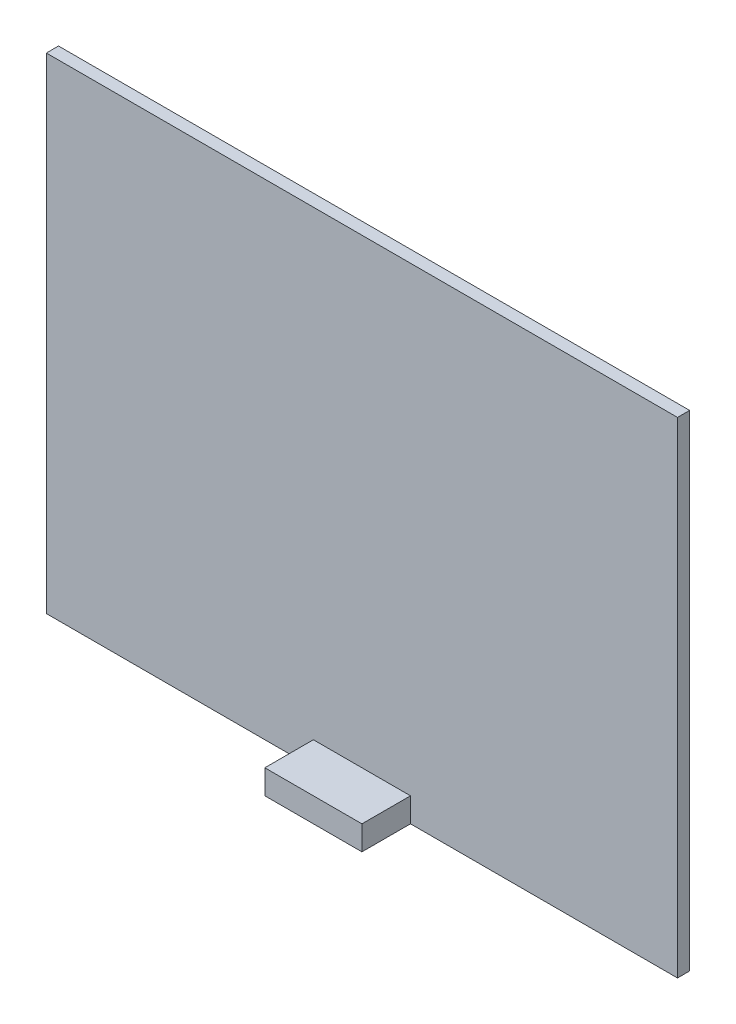
ISO-10303-21;
HEADER;
FILE_DESCRIPTION(('STEP AP214'),'2;1');
FILE_NAME('part.step','',(''),(''),'','','');
FILE_SCHEMA(('AUTOMOTIVE_DESIGN { 1 0 10303 214 1 1 1 1 }'));
ENDSEC;
DATA;
#1=APPLICATION_CONTEXT('core data for automotive mechanical design processes');
#2=APPLICATION_PROTOCOL_DEFINITION('international standard','automotive_design',2000,#1);
#3=PRODUCT_CONTEXT('',#1,'mechanical');
#4=PRODUCT('Part','Part','',(#3));
#5=PRODUCT_RELATED_PRODUCT_CATEGORY('part','',(#4));
#6=PRODUCT_DEFINITION_FORMATION('','',#4);
#7=PRODUCT_DEFINITION_CONTEXT('part definition',#1,'design');
#8=PRODUCT_DEFINITION('design','',#6,#7);
#9=PRODUCT_DEFINITION_SHAPE('','',#8);
#10=(LENGTH_UNIT() NAMED_UNIT(*) SI_UNIT(.MILLI.,.METRE.));
#11=(NAMED_UNIT(*) PLANE_ANGLE_UNIT() SI_UNIT($,.RADIAN.));
#12=(NAMED_UNIT(*) SI_UNIT($,.STERADIAN.) SOLID_ANGLE_UNIT());
#13=UNCERTAINTY_MEASURE_WITH_UNIT(LENGTH_MEASURE(1.E-05),#10,'distance_accuracy_value','');
#14=(GEOMETRIC_REPRESENTATION_CONTEXT(3) GLOBAL_UNCERTAINTY_ASSIGNED_CONTEXT((#13)) GLOBAL_UNIT_ASSIGNED_CONTEXT((#10,
#11,#12)) REPRESENTATION_CONTEXT('',''));
#15=CARTESIAN_POINT('',(0.,0.,0.));
#16=DIRECTION('',(0.,0.,1.));
#17=DIRECTION('',(1.,0.,0.));
#18=AXIS2_PLACEMENT_3D('',#15,#16,#17);
#19=CARTESIAN_POINT('',(-150.,100.,5.));
#20=DIRECTION('',(0.,-1.,0.));
#21=DIRECTION('',(0.,0.,-1.));
#22=AXIS2_PLACEMENT_3D('',#19,#20,#21);
#23=PLANE('',#22);
#24=DIRECTION('',(-1.,0.,0.));
#25=VECTOR('',#24,1.);
#26=CARTESIAN_POINT('',(-150.,100.,5.));
#27=LINE('',#26,#25);
#28=CARTESIAN_POINT('',(130.,100.,5.));
#29=VERTEX_POINT('',#28);
#30=CARTESIAN_POINT('',(-130.,100.,5.));
#31=VERTEX_POINT('',#30);
#32=EDGE_CURVE('E160',#29,#31,#27,.T.);
#33=ORIENTED_EDGE('',*,*,#32,.F.);
#34=DIRECTION('',(0.,0.,1.));
#35=VECTOR('',#34,1.);
#36=CARTESIAN_POINT('',(130.,100.,0.));
#37=LINE('',#36,#35);
#38=CARTESIAN_POINT('',(130.,100.,0.));
#39=VERTEX_POINT('',#38);
#40=EDGE_CURVE('E143',#39,#29,#37,.T.);
#41=ORIENTED_EDGE('',*,*,#40,.F.);
#42=DIRECTION('',(-1.,0.,0.));
#43=VECTOR('',#42,1.);
#44=CARTESIAN_POINT('',(-150.,100.,0.));
#45=LINE('',#44,#43);
#46=CARTESIAN_POINT('',(-130.,100.,0.));
#47=VERTEX_POINT('',#46);
#48=EDGE_CURVE('E159',#39,#47,#45,.T.);
#49=ORIENTED_EDGE('',*,*,#48,.T.);
#50=DIRECTION('',(0.,0.,1.));
#51=VECTOR('',#50,1.);
#52=CARTESIAN_POINT('',(-130.,100.,0.));
#53=LINE('',#52,#51);
#54=EDGE_CURVE('E140',#47,#31,#53,.T.);
#55=ORIENTED_EDGE('',*,*,#54,.T.);
#56=EDGE_LOOP('',(#33,#41,#49,#55));
#57=FACE_BOUND('',#56,.T.);
#58=ADVANCED_FACE('F37',(#57),#23,.F.);
#59=CARTESIAN_POINT('',(-150.,-100.,5.));
#60=DIRECTION('',(0.,1.,0.));
#61=DIRECTION('',(0.,0.,1.));
#62=AXIS2_PLACEMENT_3D('',#59,#60,#61);
#63=PLANE('',#62);
#64=DIRECTION('',(1.,0.,0.));
#65=VECTOR('',#64,1.);
#66=CARTESIAN_POINT('',(-150.,-100.,5.));
#67=LINE('',#66,#65);
#68=CARTESIAN_POINT('',(20.,-100.,5.));
#69=VERTEX_POINT('',#68);
#70=CARTESIAN_POINT('',(130.,-100.,5.));
#71=VERTEX_POINT('',#70);
#72=EDGE_CURVE('E45',#69,#71,#67,.T.);
#73=ORIENTED_EDGE('',*,*,#72,.F.);
#74=DIRECTION('',(0.,0.,1.));
#75=VECTOR('',#74,1.);
#76=CARTESIAN_POINT('',(20.,-100.,25.));
#77=LINE('',#76,#75);
#78=CARTESIAN_POINT('',(20.,-100.,25.));
#79=VERTEX_POINT('',#78);
#80=EDGE_CURVE('E129',#69,#79,#77,.T.);
#81=ORIENTED_EDGE('',*,*,#80,.T.);
#82=DIRECTION('',(-1.,0.,0.));
#83=VECTOR('',#82,1.);
#84=CARTESIAN_POINT('',(-20.,-100.,25.));
#85=LINE('',#84,#83);
#86=CARTESIAN_POINT('',(-20.,-100.,25.));
#87=VERTEX_POINT('',#86);
#88=EDGE_CURVE('E117',#79,#87,#85,.T.);
#89=ORIENTED_EDGE('',*,*,#88,.T.);
#90=DIRECTION('',(0.,0.,-1.));
#91=VECTOR('',#90,1.);
#92=CARTESIAN_POINT('',(-20.,-100.,25.));
#93=LINE('',#92,#91);
#94=CARTESIAN_POINT('',(-20.,-100.,5.));
#95=VERTEX_POINT('',#94);
#96=EDGE_CURVE('E126',#87,#95,#93,.T.);
#97=ORIENTED_EDGE('',*,*,#96,.T.);
#98=CARTESIAN_POINT('',(-130.,-100.,5.));
#99=VERTEX_POINT('',#98);
#100=EDGE_CURVE('E11',#99,#95,#67,.T.);
#101=ORIENTED_EDGE('',*,*,#100,.F.);
#102=DIRECTION('',(0.,0.,1.));
#103=VECTOR('',#102,1.);
#104=CARTESIAN_POINT('',(-130.,-100.,0.));
#105=LINE('',#104,#103);
#106=CARTESIAN_POINT('',(-130.,-100.,0.));
#107=VERTEX_POINT('',#106);
#108=EDGE_CURVE('E146',#107,#99,#105,.T.);
#109=ORIENTED_EDGE('',*,*,#108,.F.);
#110=DIRECTION('',(1.,0.,0.));
#111=VECTOR('',#110,1.);
#112=CARTESIAN_POINT('',(-150.,-100.,0.));
#113=LINE('',#112,#111);
#114=CARTESIAN_POINT('',(130.,-100.,0.));
#115=VERTEX_POINT('',#114);
#116=EDGE_CURVE('E40',#107,#115,#113,.T.);
#117=ORIENTED_EDGE('',*,*,#116,.T.);
#118=DIRECTION('',(0.,0.,1.));
#119=VECTOR('',#118,1.);
#120=CARTESIAN_POINT('',(130.,-100.,0.));
#121=LINE('',#120,#119);
#122=EDGE_CURVE('E149',#115,#71,#121,.T.);
#123=ORIENTED_EDGE('',*,*,#122,.T.);
#124=EDGE_LOOP('',(#73,#81,#89,#97,#101,#109,#117,#123));
#125=FACE_BOUND('',#124,.T.);
#126=ADVANCED_FACE('F170',(#125),#63,.F.);
#127=CARTESIAN_POINT('',(0.,0.,5.));
#128=DIRECTION('',(0.,0.,1.));
#129=DIRECTION('',(1.,0.,0.));
#130=AXIS2_PLACEMENT_3D('',#127,#128,#129);
#131=PLANE('',#130);
#132=DIRECTION('',(0.,-1.,0.));
#133=VECTOR('',#132,1.);
#134=CARTESIAN_POINT('',(-20.,0.,5.));
#135=LINE('',#134,#133);
#136=CARTESIAN_POINT('',(-20.,-90.,5.));
#137=VERTEX_POINT('',#136);
#138=EDGE_CURVE('E57',#137,#95,#135,.T.);
#139=ORIENTED_EDGE('',*,*,#138,.F.);
#140=DIRECTION('',(1.,0.,0.));
#141=VECTOR('',#140,1.);
#142=CARTESIAN_POINT('',(0.,-90.,5.));
#143=LINE('',#142,#141);
#144=CARTESIAN_POINT('',(20.,-90.,5.));
#145=VERTEX_POINT('',#144);
#146=EDGE_CURVE('E53',#137,#145,#143,.T.);
#147=ORIENTED_EDGE('',*,*,#146,.T.);
#148=DIRECTION('',(0.,1.,0.));
#149=VECTOR('',#148,1.);
#150=CARTESIAN_POINT('',(20.,0.,5.));
#151=LINE('',#150,#149);
#152=EDGE_CURVE('E107',#69,#145,#151,.T.);
#153=ORIENTED_EDGE('',*,*,#152,.F.);
#154=ORIENTED_EDGE('',*,*,#72,.T.);
#155=DIRECTION('',(0.,-1.,0.));
#156=VECTOR('',#155,1.);
#157=CARTESIAN_POINT('',(130.,-100.,5.));
#158=LINE('',#157,#156);
#159=EDGE_CURVE('E136',#29,#71,#158,.T.);
#160=ORIENTED_EDGE('',*,*,#159,.F.);
#161=ORIENTED_EDGE('',*,*,#32,.T.);
#162=DIRECTION('',(0.,1.,0.));
#163=VECTOR('',#162,1.);
#164=CARTESIAN_POINT('',(-130.,100.,5.));
#165=LINE('',#164,#163);
#166=EDGE_CURVE('E141',#99,#31,#165,.T.);
#167=ORIENTED_EDGE('',*,*,#166,.F.);
#168=ORIENTED_EDGE('',*,*,#100,.T.);
#169=EDGE_LOOP('',(#139,#147,#153,#154,#160,#161,#167,#168));
#170=FACE_BOUND('',#169,.T.);
#171=ADVANCED_FACE('F179',(#170),#131,.T.);
#172=CARTESIAN_POINT('',(0.,0.,0.));
#173=DIRECTION('',(0.,0.,1.));
#174=DIRECTION('',(1.,0.,0.));
#175=AXIS2_PLACEMENT_3D('',#172,#173,#174);
#176=PLANE('',#175);
#177=DIRECTION('',(0.,-1.,0.));
#178=VECTOR('',#177,1.);
#179=CARTESIAN_POINT('',(130.,-100.,0.));
#180=LINE('',#179,#178);
#181=EDGE_CURVE('E150',#39,#115,#180,.T.);
#182=ORIENTED_EDGE('',*,*,#181,.T.);
#183=ORIENTED_EDGE('',*,*,#116,.F.);
#184=DIRECTION('',(0.,1.,0.));
#185=VECTOR('',#184,1.);
#186=CARTESIAN_POINT('',(-130.,100.,0.));
#187=LINE('',#186,#185);
#188=EDGE_CURVE('E137',#107,#47,#187,.T.);
#189=ORIENTED_EDGE('',*,*,#188,.T.);
#190=ORIENTED_EDGE('',*,*,#48,.F.);
#191=EDGE_LOOP('',(#182,#183,#189,#190));
#192=FACE_BOUND('',#191,.T.);
#193=ADVANCED_FACE('F175',(#192),#176,.F.);
#194=CARTESIAN_POINT('',(-130.,100.,0.));
#195=DIRECTION('',(1.,0.,0.));
#196=DIRECTION('',(0.,0.,-1.));
#197=AXIS2_PLACEMENT_3D('',#194,#195,#196);
#198=PLANE('',#197);
#199=ORIENTED_EDGE('',*,*,#166,.T.);
#200=ORIENTED_EDGE('',*,*,#54,.F.);
#201=ORIENTED_EDGE('',*,*,#188,.F.);
#202=ORIENTED_EDGE('',*,*,#108,.T.);
#203=EDGE_LOOP('',(#199,#200,#201,#202));
#204=FACE_BOUND('',#203,.T.);
#205=ADVANCED_FACE('F177',(#204),#198,.F.);
#206=CARTESIAN_POINT('',(130.,-100.,0.));
#207=DIRECTION('',(-1.,0.,0.));
#208=DIRECTION('',(0.,0.,1.));
#209=AXIS2_PLACEMENT_3D('',#206,#207,#208);
#210=PLANE('',#209);
#211=ORIENTED_EDGE('',*,*,#159,.T.);
#212=ORIENTED_EDGE('',*,*,#122,.F.);
#213=ORIENTED_EDGE('',*,*,#181,.F.);
#214=ORIENTED_EDGE('',*,*,#40,.T.);
#215=EDGE_LOOP('',(#211,#212,#213,#214));
#216=FACE_BOUND('',#215,.T.);
#217=ADVANCED_FACE('F174',(#216),#210,.F.);
#218=CARTESIAN_POINT('',(-20.,-90.,25.));
#219=DIRECTION('',(-1.,0.,0.));
#220=DIRECTION('',(0.,0.,1.));
#221=AXIS2_PLACEMENT_3D('',#218,#219,#220);
#222=PLANE('',#221);
#223=DIRECTION('',(0.,0.,-1.));
#224=VECTOR('',#223,1.);
#225=CARTESIAN_POINT('',(-20.,-90.,25.));
#226=LINE('',#225,#224);
#227=CARTESIAN_POINT('',(-20.,-90.,25.));
#228=VERTEX_POINT('',#227);
#229=EDGE_CURVE('E111',#228,#137,#226,.T.);
#230=ORIENTED_EDGE('',*,*,#229,.T.);
#231=ORIENTED_EDGE('',*,*,#138,.T.);
#232=ORIENTED_EDGE('',*,*,#96,.F.);
#233=DIRECTION('',(0.,-1.,0.));
#234=VECTOR('',#233,1.);
#235=CARTESIAN_POINT('',(-20.,-90.,25.));
#236=LINE('',#235,#234);
#237=EDGE_CURVE('E118',#228,#87,#236,.T.);
#238=ORIENTED_EDGE('',*,*,#237,.F.);
#239=EDGE_LOOP('',(#230,#231,#232,#238));
#240=FACE_BOUND('',#239,.T.);
#241=ADVANCED_FACE('F182',(#240),#222,.T.);
#242=CARTESIAN_POINT('',(-20.,-90.,25.));
#243=DIRECTION('',(0.,0.,1.));
#244=DIRECTION('',(1.,0.,0.));
#245=AXIS2_PLACEMENT_3D('',#242,#243,#244);
#246=PLANE('',#245);
#247=ORIENTED_EDGE('',*,*,#88,.F.);
#248=DIRECTION('',(0.,-1.,0.));
#249=VECTOR('',#248,1.);
#250=CARTESIAN_POINT('',(20.,-90.,25.));
#251=LINE('',#250,#249);
#252=CARTESIAN_POINT('',(20.,-90.,25.));
#253=VERTEX_POINT('',#252);
#254=EDGE_CURVE('E105',#253,#79,#251,.T.);
#255=ORIENTED_EDGE('',*,*,#254,.F.);
#256=DIRECTION('',(-1.,0.,0.));
#257=VECTOR('',#256,1.);
#258=CARTESIAN_POINT('',(-20.,-90.,25.));
#259=LINE('',#258,#257);
#260=EDGE_CURVE('E110',#253,#228,#259,.T.);
#261=ORIENTED_EDGE('',*,*,#260,.T.);
#262=ORIENTED_EDGE('',*,*,#237,.T.);
#263=EDGE_LOOP('',(#247,#255,#261,#262));
#264=FACE_BOUND('',#263,.T.);
#265=ADVANCED_FACE('F115',(#264),#246,.T.);
#266=CARTESIAN_POINT('',(20.,-90.,25.));
#267=DIRECTION('',(1.,0.,0.));
#268=DIRECTION('',(0.,0.,-1.));
#269=AXIS2_PLACEMENT_3D('',#266,#267,#268);
#270=PLANE('',#269);
#271=ORIENTED_EDGE('',*,*,#80,.F.);
#272=ORIENTED_EDGE('',*,*,#152,.T.);
#273=DIRECTION('',(0.,0.,1.));
#274=VECTOR('',#273,1.);
#275=CARTESIAN_POINT('',(20.,-90.,25.));
#276=LINE('',#275,#274);
#277=EDGE_CURVE('E101',#145,#253,#276,.T.);
#278=ORIENTED_EDGE('',*,*,#277,.T.);
#279=ORIENTED_EDGE('',*,*,#254,.T.);
#280=EDGE_LOOP('',(#271,#272,#278,#279));
#281=FACE_BOUND('',#280,.T.);
#282=ADVANCED_FACE('F104',(#281),#270,.T.);
#283=CARTESIAN_POINT('',(0.,-90.,0.));
#284=DIRECTION('',(0.,-1.,0.));
#285=DIRECTION('',(0.,0.,-1.));
#286=AXIS2_PLACEMENT_3D('',#283,#284,#285);
#287=PLANE('',#286);
#288=ORIENTED_EDGE('',*,*,#146,.F.);
#289=ORIENTED_EDGE('',*,*,#229,.F.);
#290=ORIENTED_EDGE('',*,*,#260,.F.);
#291=ORIENTED_EDGE('',*,*,#277,.F.);
#292=EDGE_LOOP('',(#288,#289,#290,#291));
#293=FACE_BOUND('',#292,.T.);
#294=ADVANCED_FACE('F121',(#293),#287,.F.);
#295=CLOSED_SHELL('',(#58,#126,#171,#193,#205,#217,#241,#265,#282,#294));
#296=MANIFOLD_SOLID_BREP('B2',#295);
#297=ADVANCED_BREP_SHAPE_REPRESENTATION('',(#18,#296),#14);
#298=SHAPE_DEFINITION_REPRESENTATION(#9,#297);
ENDSEC;
END-ISO-10303-21;
